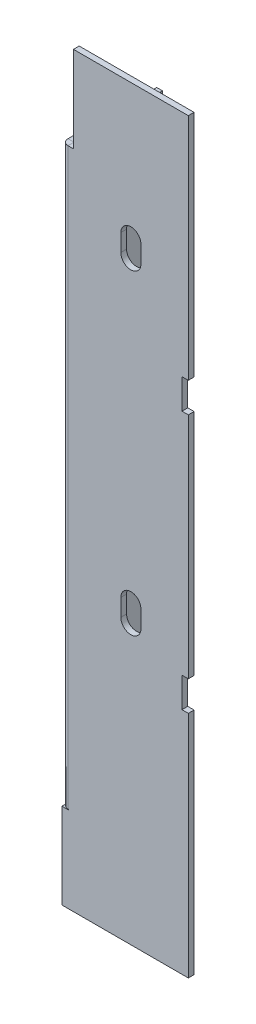
ISO-10303-21;
HEADER;
FILE_DESCRIPTION(('STEP AP214'),'2;1');
FILE_NAME('part.step','',(''),(''),'','','');
FILE_SCHEMA(('AUTOMOTIVE_DESIGN { 1 0 10303 214 1 1 1 1 }'));
ENDSEC;
DATA;
#1=APPLICATION_CONTEXT('core data for automotive mechanical design processes');
#2=APPLICATION_PROTOCOL_DEFINITION('international standard','automotive_design',2000,#1);
#3=PRODUCT_CONTEXT('',#1,'mechanical');
#4=PRODUCT('Part','Part','',(#3));
#5=PRODUCT_RELATED_PRODUCT_CATEGORY('part','',(#4));
#6=PRODUCT_DEFINITION_FORMATION('','',#4);
#7=PRODUCT_DEFINITION_CONTEXT('part definition',#1,'design');
#8=PRODUCT_DEFINITION('design','',#6,#7);
#9=PRODUCT_DEFINITION_SHAPE('','',#8);
#10=(LENGTH_UNIT() NAMED_UNIT(*) SI_UNIT(.MILLI.,.METRE.));
#11=(NAMED_UNIT(*) PLANE_ANGLE_UNIT() SI_UNIT($,.RADIAN.));
#12=(NAMED_UNIT(*) SI_UNIT($,.STERADIAN.) SOLID_ANGLE_UNIT());
#13=UNCERTAINTY_MEASURE_WITH_UNIT(LENGTH_MEASURE(1.E-05),#10,'distance_accuracy_value','');
#14=(GEOMETRIC_REPRESENTATION_CONTEXT(3) GLOBAL_UNCERTAINTY_ASSIGNED_CONTEXT((#13)) GLOBAL_UNIT_ASSIGNED_CONTEXT((#10,
#11,#12)) REPRESENTATION_CONTEXT('',''));
#15=CARTESIAN_POINT('',(0.,0.,0.));
#16=DIRECTION('',(0.,0.,1.));
#17=DIRECTION('',(1.,0.,0.));
#18=AXIS2_PLACEMENT_3D('',#15,#16,#17);
#19=CARTESIAN_POINT('',(860.745895593766,-50.,-971.));
#20=DIRECTION('',(0.,0.,1.));
#21=DIRECTION('',(1.,0.,0.));
#22=AXIS2_PLACEMENT_3D('',#19,#20,#21);
#23=PLANE('',#22);
#24=DIRECTION('',(0.,1.,0.));
#25=VECTOR('',#24,1.);
#26=CARTESIAN_POINT('',(456.,-50.,-971.));
#27=LINE('',#26,#25);
#28=CARTESIAN_POINT('',(456.,-50.,-971.));
#29=VERTEX_POINT('',#28);
#30=CARTESIAN_POINT('',(456.,150.,-971.));
#31=VERTEX_POINT('',#30);
#32=EDGE_CURVE('E267',#29,#31,#27,.T.);
#33=ORIENTED_EDGE('',*,*,#32,.T.);
#34=DIRECTION('',(-1.,0.,0.));
#35=VECTOR('',#34,1.);
#36=CARTESIAN_POINT('',(860.745895593766,150.,-971.));
#37=LINE('',#36,#35);
#38=CARTESIAN_POINT('',(458.,150.,-971.));
#39=VERTEX_POINT('',#38);
#40=EDGE_CURVE('E746',#39,#31,#37,.T.);
#41=ORIENTED_EDGE('',*,*,#40,.F.);
#42=DIRECTION('',(0.,1.,0.));
#43=VECTOR('',#42,1.);
#44=CARTESIAN_POINT('',(458.,-50.,-971.));
#45=LINE('',#44,#43);
#46=CARTESIAN_POINT('',(458.,-50.,-971.));
#47=VERTEX_POINT('',#46);
#48=EDGE_CURVE('E59',#47,#39,#45,.T.);
#49=ORIENTED_EDGE('',*,*,#48,.F.);
#50=DIRECTION('',(-1.,0.,0.));
#51=VECTOR('',#50,1.);
#52=CARTESIAN_POINT('',(860.745895593766,-50.,-971.));
#53=LINE('',#52,#51);
#54=EDGE_CURVE('E280',#47,#29,#53,.T.);
#55=ORIENTED_EDGE('',*,*,#54,.T.);
#56=EDGE_LOOP('',(#33,#41,#49,#55));
#57=FACE_BOUND('',#56,.T.);
#58=ADVANCED_FACE('F47',(#57),#23,.F.);
#59=CARTESIAN_POINT('',(860.745895593766,-50.,-971.));
#60=DIRECTION('',(0.,-1.,0.));
#61=DIRECTION('',(1.,0.,0.));
#62=AXIS2_PLACEMENT_3D('',#59,#60,#61);
#63=PLANE('',#62);
#64=DIRECTION('',(-1.,0.,0.));
#65=VECTOR('',#64,1.);
#66=CARTESIAN_POINT('',(860.745895593766,-50.,-940.1));
#67=LINE('',#66,#65);
#68=CARTESIAN_POINT('',(458.,-50.,-940.1));
#69=VERTEX_POINT('',#68);
#70=CARTESIAN_POINT('',(456.,-50.,-940.1));
#71=VERTEX_POINT('',#70);
#72=EDGE_CURVE('E270',#69,#71,#67,.T.);
#73=ORIENTED_EDGE('',*,*,#72,.T.);
#74=DIRECTION('',(0.,0.,-1.));
#75=VECTOR('',#74,1.);
#76=CARTESIAN_POINT('',(456.,-50.,-971.));
#77=LINE('',#76,#75);
#78=EDGE_CURVE('E87',#71,#29,#77,.T.);
#79=ORIENTED_EDGE('',*,*,#78,.T.);
#80=ORIENTED_EDGE('',*,*,#54,.F.);
#81=DIRECTION('',(0.,0.,1.));
#82=VECTOR('',#81,1.);
#83=CARTESIAN_POINT('',(458.,-50.,-971.));
#84=LINE('',#83,#82);
#85=EDGE_CURVE('E269',#47,#69,#84,.T.);
#86=ORIENTED_EDGE('',*,*,#85,.T.);
#87=EDGE_LOOP('',(#73,#79,#80,#86));
#88=FACE_BOUND('',#87,.T.);
#89=ADVANCED_FACE('F273',(#88),#63,.T.);
#90=CARTESIAN_POINT('',(456.,150.,-938.));
#91=DIRECTION('',(-1.,0.,0.));
#92=DIRECTION('',(0.,0.,1.));
#93=AXIS2_PLACEMENT_3D('',#90,#91,#92);
#94=PLANE('',#93);
#95=DIRECTION('',(0.,-1.,0.));
#96=VECTOR('',#95,1.);
#97=CARTESIAN_POINT('',(456.,-50.,-940.1));
#98=LINE('',#97,#96);
#99=CARTESIAN_POINT('',(456.,150.,-940.1));
#100=VERTEX_POINT('',#99);
#101=EDGE_CURVE('E264',#100,#71,#98,.T.);
#102=ORIENTED_EDGE('',*,*,#101,.F.);
#103=DIRECTION('',(0.,0.,1.));
#104=VECTOR('',#103,1.);
#105=CARTESIAN_POINT('',(456.,150.,-971.));
#106=LINE('',#105,#104);
#107=EDGE_CURVE('E745',#31,#100,#106,.T.);
#108=ORIENTED_EDGE('',*,*,#107,.F.);
#109=ORIENTED_EDGE('',*,*,#32,.F.);
#110=ORIENTED_EDGE('',*,*,#78,.F.);
#111=EDGE_LOOP('',(#102,#108,#109,#110));
#112=FACE_BOUND('',#111,.T.);
#113=ADVANCED_FACE('F261',(#112),#94,.T.);
#114=CARTESIAN_POINT('',(860.745895593766,150.,-971.));
#115=DIRECTION('',(0.,-1.,0.));
#116=DIRECTION('',(1.,0.,0.));
#117=AXIS2_PLACEMENT_3D('',#114,#115,#116);
#118=PLANE('',#117);
#119=ORIENTED_EDGE('',*,*,#107,.T.);
#120=DIRECTION('',(-1.,0.,0.));
#121=VECTOR('',#120,1.);
#122=CARTESIAN_POINT('',(860.745895593766,150.,-940.1));
#123=LINE('',#122,#121);
#124=CARTESIAN_POINT('',(458.,150.,-940.1));
#125=VERTEX_POINT('',#124);
#126=EDGE_CURVE('E291',#125,#100,#123,.T.);
#127=ORIENTED_EDGE('',*,*,#126,.F.);
#128=DIRECTION('',(0.,0.,1.));
#129=VECTOR('',#128,1.);
#130=CARTESIAN_POINT('',(458.,150.,-971.));
#131=LINE('',#130,#129);
#132=EDGE_CURVE('E12',#39,#125,#131,.T.);
#133=ORIENTED_EDGE('',*,*,#132,.F.);
#134=ORIENTED_EDGE('',*,*,#40,.T.);
#135=EDGE_LOOP('',(#119,#127,#133,#134));
#136=FACE_BOUND('',#135,.T.);
#137=ADVANCED_FACE('F739',(#136),#118,.F.);
#138=CARTESIAN_POINT('',(458.,-50.,-971.));
#139=DIRECTION('',(1.,0.,0.));
#140=DIRECTION('',(0.,0.,-1.));
#141=AXIS2_PLACEMENT_3D('',#138,#139,#140);
#142=PLANE('',#141);
#143=DIRECTION('',(0.,1.,0.));
#144=VECTOR('',#143,1.);
#145=CARTESIAN_POINT('',(458.,-50.,-940.1));
#146=LINE('',#145,#144);
#147=EDGE_CURVE('E51',#69,#125,#146,.T.);
#148=ORIENTED_EDGE('',*,*,#147,.F.);
#149=ORIENTED_EDGE('',*,*,#85,.F.);
#150=ORIENTED_EDGE('',*,*,#48,.T.);
#151=ORIENTED_EDGE('',*,*,#132,.T.);
#152=EDGE_LOOP('',(#148,#149,#150,#151));
#153=FACE_BOUND('',#152,.T.);
#154=ADVANCED_FACE('F49',(#153),#142,.T.);
#155=CARTESIAN_POINT('',(498.,-78.,-938.));
#156=DIRECTION('',(0.,0.,1.));
#157=DIRECTION('',(1.,0.,0.));
#158=AXIS2_PLACEMENT_3D('',#155,#156,#157);
#159=PLANE('',#158);
#160=CARTESIAN_POINT('',(480.,17.0000000000001,-938.));
#161=DIRECTION('',(0.,0.,-1.));
#162=DIRECTION('',(-1.,0.,0.));
#163=AXIS2_PLACEMENT_3D('',#160,#161,#162);
#164=CIRCLE('',#163,3.5);
#165=CARTESIAN_POINT('',(476.5,17.0000000000001,-938.));
#166=VERTEX_POINT('',#165);
#167=CARTESIAN_POINT('',(483.5,17.0000000000001,-938.));
#168=VERTEX_POINT('',#167);
#169=EDGE_CURVE('E414',#166,#168,#164,.F.);
#170=ORIENTED_EDGE('',*,*,#169,.F.);
#171=DIRECTION('',(0.,-1.,0.));
#172=VECTOR('',#171,1.);
#173=CARTESIAN_POINT('',(476.5,17.0000000000001,-938.));
#174=LINE('',#173,#172);
#175=CARTESIAN_POINT('',(476.5,23.0000000000001,-938.));
#176=VERTEX_POINT('',#175);
#177=EDGE_CURVE('E407',#176,#166,#174,.T.);
#178=ORIENTED_EDGE('',*,*,#177,.F.);
#179=CARTESIAN_POINT('',(480.,23.0000000000001,-938.));
#180=DIRECTION('',(0.,0.,-1.));
#181=DIRECTION('',(-1.,0.,0.));
#182=AXIS2_PLACEMENT_3D('',#179,#180,#181);
#183=CIRCLE('',#182,3.5);
#184=CARTESIAN_POINT('',(483.5,23.0000000000001,-938.));
#185=VERTEX_POINT('',#184);
#186=EDGE_CURVE('E413',#185,#176,#183,.F.);
#187=ORIENTED_EDGE('',*,*,#186,.F.);
#188=DIRECTION('',(0.,1.,0.));
#189=VECTOR('',#188,1.);
#190=CARTESIAN_POINT('',(483.5,17.0000000000001,-938.));
#191=LINE('',#190,#189);
#192=EDGE_CURVE('E418',#168,#185,#191,.T.);
#193=ORIENTED_EDGE('',*,*,#192,.F.);
#194=EDGE_LOOP('',(#170,#178,#187,#193));
#195=FACE_BOUND('',#194,.T.);
#196=CARTESIAN_POINT('',(480.,127.,-938.));
#197=DIRECTION('',(0.,0.,-1.));
#198=DIRECTION('',(-1.,0.,0.));
#199=AXIS2_PLACEMENT_3D('',#196,#197,#198);
#200=CIRCLE('',#199,3.5);
#201=CARTESIAN_POINT('',(476.5,127.,-938.));
#202=VERTEX_POINT('',#201);
#203=CARTESIAN_POINT('',(483.5,127.,-938.));
#204=VERTEX_POINT('',#203);
#205=EDGE_CURVE('E423',#202,#204,#200,.F.);
#206=ORIENTED_EDGE('',*,*,#205,.F.);
#207=DIRECTION('',(0.,-1.,0.));
#208=VECTOR('',#207,1.);
#209=CARTESIAN_POINT('',(476.5,127.,-938.));
#210=LINE('',#209,#208);
#211=CARTESIAN_POINT('',(476.5,133.,-938.));
#212=VERTEX_POINT('',#211);
#213=EDGE_CURVE('E426',#212,#202,#210,.T.);
#214=ORIENTED_EDGE('',*,*,#213,.F.);
#215=CARTESIAN_POINT('',(480.,133.,-938.));
#216=DIRECTION('',(0.,0.,-1.));
#217=DIRECTION('',(-1.,0.,0.));
#218=AXIS2_PLACEMENT_3D('',#215,#216,#217);
#219=CIRCLE('',#218,3.50000000000003);
#220=CARTESIAN_POINT('',(483.5,133.,-938.));
#221=VERTEX_POINT('',#220);
#222=EDGE_CURVE('E577',#221,#212,#219,.F.);
#223=ORIENTED_EDGE('',*,*,#222,.F.);
#224=DIRECTION('',(0.,1.,0.));
#225=VECTOR('',#224,1.);
#226=CARTESIAN_POINT('',(483.5,127.,-938.));
#227=LINE('',#226,#225);
#228=EDGE_CURVE('E431',#204,#221,#227,.T.);
#229=ORIENTED_EDGE('',*,*,#228,.F.);
#230=EDGE_LOOP('',(#206,#214,#223,#229));
#231=FACE_BOUND('',#230,.T.);
#232=DIRECTION('',(1.,0.,0.));
#233=VECTOR('',#232,1.);
#234=CARTESIAN_POINT('',(458.,150.,-938.));
#235=LINE('',#234,#233);
#236=CARTESIAN_POINT('',(458.1,150.,-938.));
#237=VERTEX_POINT('',#236);
#238=CARTESIAN_POINT('',(460.,150.,-938.));
#239=VERTEX_POINT('',#238);
#240=EDGE_CURVE('E440',#237,#239,#235,.T.);
#241=ORIENTED_EDGE('',*,*,#240,.F.);
#242=DIRECTION('',(0.,-1.,0.));
#243=VECTOR('',#242,1.);
#244=CARTESIAN_POINT('',(458.1,-50.,-938.));
#245=LINE('',#244,#243);
#246=CARTESIAN_POINT('',(458.1,-50.,-938.));
#247=VERTEX_POINT('',#246);
#248=EDGE_CURVE('E322',#237,#247,#245,.T.);
#249=ORIENTED_EDGE('',*,*,#248,.T.);
#250=DIRECTION('',(1.,0.,0.));
#251=VECTOR('',#250,1.);
#252=CARTESIAN_POINT('',(498.,-50.,-938.));
#253=LINE('',#252,#251);
#254=CARTESIAN_POINT('',(458.3,-50.,-938.));
#255=VERTEX_POINT('',#254);
#256=EDGE_CURVE('E445',#247,#255,#253,.T.);
#257=ORIENTED_EDGE('',*,*,#256,.T.);
#258=DIRECTION('',(0.,-1.,0.));
#259=VECTOR('',#258,1.);
#260=CARTESIAN_POINT('',(458.3,-78.,-938.));
#261=LINE('',#260,#259);
#262=CARTESIAN_POINT('',(458.3,-50.2,-938.));
#263=VERTEX_POINT('',#262);
#264=EDGE_CURVE('E718',#255,#263,#261,.T.);
#265=ORIENTED_EDGE('',*,*,#264,.T.);
#266=DIRECTION('',(-1.,0.,0.));
#267=VECTOR('',#266,1.);
#268=CARTESIAN_POINT('',(498.,-50.2,-938.));
#269=LINE('',#268,#267);
#270=CARTESIAN_POINT('',(456.,-50.2,-938.));
#271=VERTEX_POINT('',#270);
#272=EDGE_CURVE('E1059',#263,#271,#269,.T.);
#273=ORIENTED_EDGE('',*,*,#272,.T.);
#274=DIRECTION('',(0.,1.,0.));
#275=VECTOR('',#274,1.);
#276=CARTESIAN_POINT('',(456.,150.,-938.));
#277=LINE('',#276,#275);
#278=CARTESIAN_POINT('',(456.,-80.,-938.));
#279=VERTEX_POINT('',#278);
#280=EDGE_CURVE('E1070',#279,#271,#277,.T.);
#281=ORIENTED_EDGE('',*,*,#280,.F.);
#282=DIRECTION('',(1.,0.,0.));
#283=VECTOR('',#282,1.);
#284=CARTESIAN_POINT('',(498.,-79.9999999999999,-938.));
#285=LINE('',#284,#283);
#286=CARTESIAN_POINT('',(500.,-80.,-937.999999999988));
#287=VERTEX_POINT('',#286);
#288=EDGE_CURVE('E1066',#279,#287,#285,.T.);
#289=ORIENTED_EDGE('',*,*,#288,.T.);
#290=DIRECTION('',(0.,1.,0.));
#291=VECTOR('',#290,1.);
#292=CARTESIAN_POINT('',(500.,180.,-938.));
#293=LINE('',#292,#291);
#294=CARTESIAN_POINT('',(500.,-0.200000000000033,-938.));
#295=VERTEX_POINT('',#294);
#296=EDGE_CURVE('E1069',#287,#295,#293,.T.);
#297=ORIENTED_EDGE('',*,*,#296,.T.);
#298=DIRECTION('',(-1.,0.,0.));
#299=VECTOR('',#298,1.);
#300=CARTESIAN_POINT('',(500.2,-0.199999999999986,-937.999999999991));
#301=LINE('',#300,#299);
#302=CARTESIAN_POINT('',(497.8,-0.199999999999986,-937.999999999991));
#303=VERTEX_POINT('',#302);
#304=EDGE_CURVE('E1074',#295,#303,#301,.T.);
#305=ORIENTED_EDGE('',*,*,#304,.T.);
#306=DIRECTION('',(0.,-1.,0.));
#307=VECTOR('',#306,1.);
#308=CARTESIAN_POINT('',(497.8,10.2,-937.999999999992));
#309=LINE('',#308,#307);
#310=CARTESIAN_POINT('',(497.8,10.2,-937.999999999992));
#311=VERTEX_POINT('',#310);
#312=EDGE_CURVE('E680',#311,#303,#309,.T.);
#313=ORIENTED_EDGE('',*,*,#312,.F.);
#314=DIRECTION('',(-1.,0.,0.));
#315=VECTOR('',#314,1.);
#316=CARTESIAN_POINT('',(500.2,10.2,-937.999999999992));
#317=LINE('',#316,#315);
#318=CARTESIAN_POINT('',(500.,10.2,-937.999999999992));
#319=VERTEX_POINT('',#318);
#320=EDGE_CURVE('E674',#319,#311,#317,.T.);
#321=ORIENTED_EDGE('',*,*,#320,.F.);
#322=DIRECTION('',(0.,1.,0.));
#323=VECTOR('',#322,1.);
#324=CARTESIAN_POINT('',(500.,180.,-938.));
#325=LINE('',#324,#323);
#326=CARTESIAN_POINT('',(500.,89.8,-938.));
#327=VERTEX_POINT('',#326);
#328=EDGE_CURVE('E670',#319,#327,#325,.T.);
#329=ORIENTED_EDGE('',*,*,#328,.T.);
#330=DIRECTION('',(-1.,0.,0.));
#331=VECTOR('',#330,1.);
#332=CARTESIAN_POINT('',(500.2,89.8,-937.999999999996));
#333=LINE('',#332,#331);
#334=CARTESIAN_POINT('',(497.8,89.8,-937.999999999996));
#335=VERTEX_POINT('',#334);
#336=EDGE_CURVE('E673',#327,#335,#333,.T.);
#337=ORIENTED_EDGE('',*,*,#336,.T.);
#338=DIRECTION('',(0.,-1.,0.));
#339=VECTOR('',#338,1.);
#340=CARTESIAN_POINT('',(497.8,100.2,-937.999999999996));
#341=LINE('',#340,#339);
#342=CARTESIAN_POINT('',(497.8,100.2,-937.999999999996));
#343=VERTEX_POINT('',#342);
#344=EDGE_CURVE('E678',#343,#335,#341,.T.);
#345=ORIENTED_EDGE('',*,*,#344,.F.);
#346=DIRECTION('',(-1.,0.,0.));
#347=VECTOR('',#346,1.);
#348=CARTESIAN_POINT('',(500.2,100.2,-937.999999999996));
#349=LINE('',#348,#347);
#350=CARTESIAN_POINT('',(500.,100.2,-937.999999999996));
#351=VERTEX_POINT('',#350);
#352=EDGE_CURVE('E684',#351,#343,#349,.T.);
#353=ORIENTED_EDGE('',*,*,#352,.F.);
#354=CARTESIAN_POINT('',(500.,180.,-938.));
#355=VERTEX_POINT('',#354);
#356=EDGE_CURVE('E647',#351,#355,#325,.T.);
#357=ORIENTED_EDGE('',*,*,#356,.T.);
#358=DIRECTION('',(-1.,0.,0.));
#359=VECTOR('',#358,1.);
#360=CARTESIAN_POINT('',(0.,180.,-938.));
#361=LINE('',#360,#359);
#362=CARTESIAN_POINT('',(460.,180.,-938.));
#363=VERTEX_POINT('',#362);
#364=EDGE_CURVE('E643',#355,#363,#361,.T.);
#365=ORIENTED_EDGE('',*,*,#364,.T.);
#366=DIRECTION('',(0.,-1.,0.));
#367=VECTOR('',#366,1.);
#368=CARTESIAN_POINT('',(460.,150.,-938.));
#369=LINE('',#368,#367);
#370=EDGE_CURVE('E446',#363,#239,#369,.T.);
#371=ORIENTED_EDGE('',*,*,#370,.T.);
#372=EDGE_LOOP('',(#241,#249,#257,#265,#273,#281,#289,#297,#305,#313,#321,#329,#337,#345,#353,
#357,#365,#371));
#373=FACE_BOUND('',#372,.T.);
#374=ADVANCED_FACE('F596',(#195,#231,#373),#159,.T.);
#375=CARTESIAN_POINT('',(0.,0.,-940.));
#376=DIRECTION('',(0.,0.,1.));
#377=DIRECTION('',(1.,0.,0.));
#378=AXIS2_PLACEMENT_3D('',#375,#376,#377);
#379=PLANE('',#378);
#380=CARTESIAN_POINT('',(480.,23.0000000000001,-940.));
#381=DIRECTION('',(0.,0.,-1.));
#382=DIRECTION('',(-1.,0.,0.));
#383=AXIS2_PLACEMENT_3D('',#380,#381,#382);
#384=CIRCLE('',#383,3.5);
#385=CARTESIAN_POINT('',(476.5,23.0000000000001,-940.));
#386=VERTEX_POINT('',#385);
#387=CARTESIAN_POINT('',(483.5,23.0000000000001,-940.));
#388=VERTEX_POINT('',#387);
#389=EDGE_CURVE('E494',#386,#388,#384,.T.);
#390=ORIENTED_EDGE('',*,*,#389,.F.);
#391=DIRECTION('',(0.,1.,0.));
#392=VECTOR('',#391,1.);
#393=CARTESIAN_POINT('',(476.5,17.0000000000001,-940.));
#394=LINE('',#393,#392);
#395=CARTESIAN_POINT('',(476.5,17.0000000000001,-940.));
#396=VERTEX_POINT('',#395);
#397=EDGE_CURVE('E612',#396,#386,#394,.T.);
#398=ORIENTED_EDGE('',*,*,#397,.F.);
#399=CARTESIAN_POINT('',(480.,17.0000000000001,-940.));
#400=DIRECTION('',(0.,0.,-1.));
#401=DIRECTION('',(-1.,0.,0.));
#402=AXIS2_PLACEMENT_3D('',#399,#400,#401);
#403=CIRCLE('',#402,3.5);
#404=CARTESIAN_POINT('',(483.5,17.0000000000001,-940.));
#405=VERTEX_POINT('',#404);
#406=EDGE_CURVE('E607',#405,#396,#403,.T.);
#407=ORIENTED_EDGE('',*,*,#406,.F.);
#408=DIRECTION('',(0.,-1.,0.));
#409=VECTOR('',#408,1.);
#410=CARTESIAN_POINT('',(483.5,17.0000000000001,-940.));
#411=LINE('',#410,#409);
#412=EDGE_CURVE('E603',#388,#405,#411,.T.);
#413=ORIENTED_EDGE('',*,*,#412,.F.);
#414=EDGE_LOOP('',(#390,#398,#407,#413));
#415=FACE_BOUND('',#414,.T.);
#416=CARTESIAN_POINT('',(480.,133.,-940.));
#417=DIRECTION('',(0.,0.,-1.));
#418=DIRECTION('',(-1.,0.,0.));
#419=AXIS2_PLACEMENT_3D('',#416,#417,#418);
#420=CIRCLE('',#419,3.50000000000003);
#421=CARTESIAN_POINT('',(476.5,133.,-940.));
#422=VERTEX_POINT('',#421);
#423=CARTESIAN_POINT('',(483.5,133.,-940.));
#424=VERTEX_POINT('',#423);
#425=EDGE_CURVE('E302',#422,#424,#420,.T.);
#426=ORIENTED_EDGE('',*,*,#425,.F.);
#427=DIRECTION('',(0.,1.,0.));
#428=VECTOR('',#427,1.);
#429=CARTESIAN_POINT('',(476.5,127.,-940.));
#430=LINE('',#429,#428);
#431=CARTESIAN_POINT('',(476.5,127.,-940.));
#432=VERTEX_POINT('',#431);
#433=EDGE_CURVE('E480',#432,#422,#430,.T.);
#434=ORIENTED_EDGE('',*,*,#433,.F.);
#435=CARTESIAN_POINT('',(480.,127.,-940.));
#436=DIRECTION('',(0.,0.,-1.));
#437=DIRECTION('',(-1.,0.,0.));
#438=AXIS2_PLACEMENT_3D('',#435,#436,#437);
#439=CIRCLE('',#438,3.5);
#440=CARTESIAN_POINT('',(483.5,127.,-940.));
#441=VERTEX_POINT('',#440);
#442=EDGE_CURVE('E485',#441,#432,#439,.T.);
#443=ORIENTED_EDGE('',*,*,#442,.F.);
#444=DIRECTION('',(0.,-1.,0.));
#445=VECTOR('',#444,1.);
#446=CARTESIAN_POINT('',(483.5,127.,-940.));
#447=LINE('',#446,#445);
#448=EDGE_CURVE('E490',#424,#441,#447,.T.);
#449=ORIENTED_EDGE('',*,*,#448,.F.);
#450=EDGE_LOOP('',(#426,#434,#443,#449));
#451=FACE_BOUND('',#450,.T.);
#452=DIRECTION('',(0.,-1.,0.));
#453=VECTOR('',#452,1.);
#454=CARTESIAN_POINT('',(458.1,-50.,-940.));
#455=LINE('',#454,#453);
#456=CARTESIAN_POINT('',(458.1,150.,-940.));
#457=VERTEX_POINT('',#456);
#458=CARTESIAN_POINT('',(458.1,-50.,-940.));
#459=VERTEX_POINT('',#458);
#460=EDGE_CURVE('E316',#457,#459,#455,.T.);
#461=ORIENTED_EDGE('',*,*,#460,.F.);
#462=DIRECTION('',(1.,0.,0.));
#463=VECTOR('',#462,1.);
#464=CARTESIAN_POINT('',(458.,150.,-940.));
#465=LINE('',#464,#463);
#466=CARTESIAN_POINT('',(460.,150.,-940.));
#467=VERTEX_POINT('',#466);
#468=EDGE_CURVE('E511',#457,#467,#465,.T.);
#469=ORIENTED_EDGE('',*,*,#468,.T.);
#470=DIRECTION('',(0.,1.,0.));
#471=VECTOR('',#470,1.);
#472=CARTESIAN_POINT('',(460.,150.,-940.));
#473=LINE('',#472,#471);
#474=CARTESIAN_POINT('',(460.,180.,-940.));
#475=VERTEX_POINT('',#474);
#476=EDGE_CURVE('E98',#467,#475,#473,.T.);
#477=ORIENTED_EDGE('',*,*,#476,.T.);
#478=DIRECTION('',(-1.,0.,0.));
#479=VECTOR('',#478,1.);
#480=CARTESIAN_POINT('',(-500.,180.,-940.));
#481=LINE('',#480,#479);
#482=CARTESIAN_POINT('',(500.,180.,-940.));
#483=VERTEX_POINT('',#482);
#484=EDGE_CURVE('E106',#483,#475,#481,.T.);
#485=ORIENTED_EDGE('',*,*,#484,.F.);
#486=DIRECTION('',(0.,-1.,0.));
#487=VECTOR('',#486,1.);
#488=CARTESIAN_POINT('',(500.,180.,-940.));
#489=LINE('',#488,#487);
#490=CARTESIAN_POINT('',(500.,100.2,-940.));
#491=VERTEX_POINT('',#490);
#492=EDGE_CURVE('E524',#483,#491,#489,.T.);
#493=ORIENTED_EDGE('',*,*,#492,.T.);
#494=DIRECTION('',(-1.,0.,0.));
#495=VECTOR('',#494,1.);
#496=CARTESIAN_POINT('',(500.2,100.2,-940.000000000008));
#497=LINE('',#496,#495);
#498=CARTESIAN_POINT('',(497.8,100.2,-940.));
#499=VERTEX_POINT('',#498);
#500=EDGE_CURVE('E532',#491,#499,#497,.T.);
#501=ORIENTED_EDGE('',*,*,#500,.T.);
#502=DIRECTION('',(0.,1.,0.));
#503=VECTOR('',#502,1.);
#504=CARTESIAN_POINT('',(497.8,100.2,-940.000000000008));
#505=LINE('',#504,#503);
#506=CARTESIAN_POINT('',(497.8,89.7999999999999,-940.));
#507=VERTEX_POINT('',#506);
#508=EDGE_CURVE('E536',#507,#499,#505,.T.);
#509=ORIENTED_EDGE('',*,*,#508,.F.);
#510=DIRECTION('',(-1.,0.,0.));
#511=VECTOR('',#510,1.);
#512=CARTESIAN_POINT('',(500.2,89.7999999999999,-940.000000000008));
#513=LINE('',#512,#511);
#514=CARTESIAN_POINT('',(500.,89.7999999999999,-940.));
#515=VERTEX_POINT('',#514);
#516=EDGE_CURVE('E540',#515,#507,#513,.T.);
#517=ORIENTED_EDGE('',*,*,#516,.F.);
#518=CARTESIAN_POINT('',(500.,10.1999999999999,-940.));
#519=VERTEX_POINT('',#518);
#520=EDGE_CURVE('E544',#515,#519,#489,.T.);
#521=ORIENTED_EDGE('',*,*,#520,.T.);
#522=DIRECTION('',(-1.,0.,0.));
#523=VECTOR('',#522,1.);
#524=CARTESIAN_POINT('',(500.2,10.1999999999999,-940.000000000004));
#525=LINE('',#524,#523);
#526=CARTESIAN_POINT('',(497.8,10.1999999999999,-940.));
#527=VERTEX_POINT('',#526);
#528=EDGE_CURVE('E545',#519,#527,#525,.T.);
#529=ORIENTED_EDGE('',*,*,#528,.T.);
#530=DIRECTION('',(0.,1.,0.));
#531=VECTOR('',#530,1.);
#532=CARTESIAN_POINT('',(497.8,10.1999999999999,-940.000000000004));
#533=LINE('',#532,#531);
#534=CARTESIAN_POINT('',(497.8,-0.200000000000072,-940.));
#535=VERTEX_POINT('',#534);
#536=EDGE_CURVE('E554',#535,#527,#533,.T.);
#537=ORIENTED_EDGE('',*,*,#536,.F.);
#538=DIRECTION('',(-1.,0.,0.));
#539=VECTOR('',#538,1.);
#540=CARTESIAN_POINT('',(500.2,-0.200000000000072,-940.000000000004));
#541=LINE('',#540,#539);
#542=CARTESIAN_POINT('',(500.,-0.200000000000072,-940.));
#543=VERTEX_POINT('',#542);
#544=EDGE_CURVE('E557',#543,#535,#541,.T.);
#545=ORIENTED_EDGE('',*,*,#544,.F.);
#546=DIRECTION('',(0.,-1.,0.));
#547=VECTOR('',#546,1.);
#548=CARTESIAN_POINT('',(500.,180.,-940.));
#549=LINE('',#548,#547);
#550=CARTESIAN_POINT('',(500.,-80.,-940.));
#551=VERTEX_POINT('',#550);
#552=EDGE_CURVE('E561',#543,#551,#549,.T.);
#553=ORIENTED_EDGE('',*,*,#552,.T.);
#554=DIRECTION('',(1.,0.,0.));
#555=VECTOR('',#554,1.);
#556=CARTESIAN_POINT('',(500.,-80.,-940.));
#557=LINE('',#556,#555);
#558=CARTESIAN_POINT('',(456.,-80.,-940.));
#559=VERTEX_POINT('',#558);
#560=EDGE_CURVE('E566',#559,#551,#557,.T.);
#561=ORIENTED_EDGE('',*,*,#560,.F.);
#562=DIRECTION('',(0.,-1.,0.));
#563=VECTOR('',#562,1.);
#564=CARTESIAN_POINT('',(456.,0.,-940.));
#565=LINE('',#564,#563);
#566=CARTESIAN_POINT('',(456.,-50.2,-940.));
#567=VERTEX_POINT('',#566);
#568=EDGE_CURVE('E573',#567,#559,#565,.T.);
#569=ORIENTED_EDGE('',*,*,#568,.F.);
#570=DIRECTION('',(-1.,0.,0.));
#571=VECTOR('',#570,1.);
#572=CARTESIAN_POINT('',(0.,-50.2,-940.));
#573=LINE('',#572,#571);
#574=CARTESIAN_POINT('',(458.3,-50.2,-940.));
#575=VERTEX_POINT('',#574);
#576=EDGE_CURVE('E606',#575,#567,#573,.T.);
#577=ORIENTED_EDGE('',*,*,#576,.F.);
#578=DIRECTION('',(0.,-1.,0.));
#579=VECTOR('',#578,1.);
#580=CARTESIAN_POINT('',(458.3,0.,-940.));
#581=LINE('',#580,#579);
#582=CARTESIAN_POINT('',(458.3,-50.,-940.));
#583=VERTEX_POINT('',#582);
#584=EDGE_CURVE('E611',#583,#575,#581,.T.);
#585=ORIENTED_EDGE('',*,*,#584,.F.);
#586=DIRECTION('',(1.,0.,0.));
#587=VECTOR('',#586,1.);
#588=CARTESIAN_POINT('',(0.,-50.,-940.));
#589=LINE('',#588,#587);
#590=EDGE_CURVE('E515',#459,#583,#589,.T.);
#591=ORIENTED_EDGE('',*,*,#590,.F.);
#592=EDGE_LOOP('',(#461,#469,#477,#485,#493,#501,#509,#517,#521,#529,#537,#545,#553,#561,#569,
#577,#585,#591));
#593=FACE_BOUND('',#592,.T.);
#594=ADVANCED_FACE('F632',(#415,#451,#593),#379,.F.);
#595=CARTESIAN_POINT('',(476.5,127.,940.001));
#596=DIRECTION('',(-1.,0.,0.));
#597=DIRECTION('',(0.,-1.,0.));
#598=AXIS2_PLACEMENT_3D('',#595,#596,#597);
#599=PLANE('',#598);
#600=ORIENTED_EDGE('',*,*,#213,.T.);
#601=DIRECTION('',(0.,0.,-1.));
#602=VECTOR('',#601,1.);
#603=CARTESIAN_POINT('',(476.5,127.,940.001));
#604=LINE('',#603,#602);
#605=EDGE_CURVE('E323',#202,#432,#604,.T.);
#606=ORIENTED_EDGE('',*,*,#605,.T.);
#607=ORIENTED_EDGE('',*,*,#433,.T.);
#608=DIRECTION('',(0.,0.,-1.));
#609=VECTOR('',#608,1.);
#610=CARTESIAN_POINT('',(476.5,133.,940.001));
#611=LINE('',#610,#609);
#612=EDGE_CURVE('E580',#212,#422,#611,.T.);
#613=ORIENTED_EDGE('',*,*,#612,.F.);
#614=EDGE_LOOP('',(#600,#606,#607,#613));
#615=FACE_BOUND('',#614,.T.);
#616=ADVANCED_FACE('F478',(#615),#599,.F.);
#617=CARTESIAN_POINT('',(483.5,127.,940.001));
#618=DIRECTION('',(1.,0.,0.));
#619=DIRECTION('',(0.,0.,-1.));
#620=AXIS2_PLACEMENT_3D('',#617,#618,#619);
#621=PLANE('',#620);
#622=ORIENTED_EDGE('',*,*,#228,.T.);
#623=DIRECTION('',(0.,0.,-1.));
#624=VECTOR('',#623,1.);
#625=CARTESIAN_POINT('',(483.5,133.,940.001));
#626=LINE('',#625,#624);
#627=EDGE_CURVE('E582',#221,#424,#626,.T.);
#628=ORIENTED_EDGE('',*,*,#627,.T.);
#629=ORIENTED_EDGE('',*,*,#448,.T.);
#630=DIRECTION('',(0.,0.,-1.));
#631=VECTOR('',#630,1.);
#632=CARTESIAN_POINT('',(483.5,127.,940.001));
#633=LINE('',#632,#631);
#634=EDGE_CURVE('E467',#204,#441,#633,.T.);
#635=ORIENTED_EDGE('',*,*,#634,.F.);
#636=EDGE_LOOP('',(#622,#628,#629,#635));
#637=FACE_BOUND('',#636,.T.);
#638=ADVANCED_FACE('F719',(#637),#621,.F.);
#639=CARTESIAN_POINT('',(480.,127.,940.001));
#640=DIRECTION('',(0.,0.,-1.));
#641=DIRECTION('',(-1.,0.,0.));
#642=AXIS2_PLACEMENT_3D('',#639,#640,#641);
#643=CYLINDRICAL_SURFACE('',#642,3.5);
#644=ORIENTED_EDGE('',*,*,#205,.T.);
#645=ORIENTED_EDGE('',*,*,#634,.T.);
#646=ORIENTED_EDGE('',*,*,#442,.T.);
#647=ORIENTED_EDGE('',*,*,#605,.F.);
#648=EDGE_LOOP('',(#644,#645,#646,#647));
#649=FACE_BOUND('',#648,.T.);
#650=ADVANCED_FACE('F483',(#649),#643,.F.);
#651=CARTESIAN_POINT('',(476.5,17.0000000000001,940.001));
#652=DIRECTION('',(-1.,0.,0.));
#653=DIRECTION('',(0.,0.,1.));
#654=AXIS2_PLACEMENT_3D('',#651,#652,#653);
#655=PLANE('',#654);
#656=ORIENTED_EDGE('',*,*,#177,.T.);
#657=DIRECTION('',(0.,0.,-1.));
#658=VECTOR('',#657,1.);
#659=CARTESIAN_POINT('',(476.5,17.0000000000001,940.001));
#660=LINE('',#659,#658);
#661=EDGE_CURVE('E456',#166,#396,#660,.T.);
#662=ORIENTED_EDGE('',*,*,#661,.T.);
#663=ORIENTED_EDGE('',*,*,#397,.T.);
#664=DIRECTION('',(0.,0.,-1.));
#665=VECTOR('',#664,1.);
#666=CARTESIAN_POINT('',(476.5,23.0000000000001,940.001));
#667=LINE('',#666,#665);
#668=EDGE_CURVE('E464',#176,#386,#667,.T.);
#669=ORIENTED_EDGE('',*,*,#668,.F.);
#670=EDGE_LOOP('',(#656,#662,#663,#669));
#671=FACE_BOUND('',#670,.T.);
#672=ADVANCED_FACE('F710',(#671),#655,.F.);
#673=CARTESIAN_POINT('',(480.,23.0000000000001,940.001));
#674=DIRECTION('',(0.,0.,-1.));
#675=DIRECTION('',(-1.,0.,0.));
#676=AXIS2_PLACEMENT_3D('',#673,#674,#675);
#677=CYLINDRICAL_SURFACE('',#676,3.5);
#678=ORIENTED_EDGE('',*,*,#186,.T.);
#679=ORIENTED_EDGE('',*,*,#668,.T.);
#680=ORIENTED_EDGE('',*,*,#389,.T.);
#681=DIRECTION('',(0.,0.,-1.));
#682=VECTOR('',#681,1.);
#683=CARTESIAN_POINT('',(483.5,23.0000000000001,940.001));
#684=LINE('',#683,#682);
#685=EDGE_CURVE('E460',#185,#388,#684,.T.);
#686=ORIENTED_EDGE('',*,*,#685,.F.);
#687=EDGE_LOOP('',(#678,#679,#680,#686));
#688=FACE_BOUND('',#687,.T.);
#689=ADVANCED_FACE('F712',(#688),#677,.F.);
#690=CARTESIAN_POINT('',(483.5,17.0000000000001,940.001));
#691=DIRECTION('',(1.,0.,0.));
#692=DIRECTION('',(0.,0.,-1.));
#693=AXIS2_PLACEMENT_3D('',#690,#691,#692);
#694=PLANE('',#693);
#695=ORIENTED_EDGE('',*,*,#192,.T.);
#696=ORIENTED_EDGE('',*,*,#685,.T.);
#697=ORIENTED_EDGE('',*,*,#412,.T.);
#698=DIRECTION('',(0.,0.,-1.));
#699=VECTOR('',#698,1.);
#700=CARTESIAN_POINT('',(483.5,17.0000000000001,940.001));
#701=LINE('',#700,#699);
#702=EDGE_CURVE('E452',#168,#405,#701,.T.);
#703=ORIENTED_EDGE('',*,*,#702,.F.);
#704=EDGE_LOOP('',(#695,#696,#697,#703));
#705=FACE_BOUND('',#704,.T.);
#706=ADVANCED_FACE('F601',(#705),#694,.F.);
#707=CARTESIAN_POINT('',(480.,17.0000000000001,940.001));
#708=DIRECTION('',(0.,0.,-1.));
#709=DIRECTION('',(-1.,0.,0.));
#710=AXIS2_PLACEMENT_3D('',#707,#708,#709);
#711=CYLINDRICAL_SURFACE('',#710,3.5);
#712=ORIENTED_EDGE('',*,*,#169,.T.);
#713=ORIENTED_EDGE('',*,*,#702,.T.);
#714=ORIENTED_EDGE('',*,*,#406,.T.);
#715=ORIENTED_EDGE('',*,*,#661,.F.);
#716=EDGE_LOOP('',(#712,#713,#714,#715));
#717=FACE_BOUND('',#716,.T.);
#718=ADVANCED_FACE('F592',(#717),#711,.F.);
#719=CARTESIAN_POINT('',(480.,133.,940.001));
#720=DIRECTION('',(0.,0.,-1.));
#721=DIRECTION('',(-1.,0.,0.));
#722=AXIS2_PLACEMENT_3D('',#719,#720,#721);
#723=CYLINDRICAL_SURFACE('',#722,3.50000000000003);
#724=ORIENTED_EDGE('',*,*,#222,.T.);
#725=ORIENTED_EDGE('',*,*,#612,.T.);
#726=ORIENTED_EDGE('',*,*,#425,.T.);
#727=ORIENTED_EDGE('',*,*,#627,.F.);
#728=EDGE_LOOP('',(#724,#725,#726,#727));
#729=FACE_BOUND('',#728,.T.);
#730=ADVANCED_FACE('F716',(#729),#723,.F.);
#731=CARTESIAN_POINT('',(0.,-50.,-1465.39359116318));
#732=DIRECTION('',(0.,-1.,0.));
#733=DIRECTION('',(0.,0.,-1.));
#734=AXIS2_PLACEMENT_3D('',#731,#732,#733);
#735=PLANE('',#734);
#736=DIRECTION('',(0.,0.,1.));
#737=VECTOR('',#736,1.);
#738=CARTESIAN_POINT('',(458.3,-50.,-1465.39359116318));
#739=LINE('',#738,#737);
#740=EDGE_CURVE('E328',#583,#255,#739,.T.);
#741=ORIENTED_EDGE('',*,*,#740,.T.);
#742=ORIENTED_EDGE('',*,*,#256,.F.);
#743=DIRECTION('',(0.,0.,1.));
#744=VECTOR('',#743,1.);
#745=CARTESIAN_POINT('',(458.1,-50.,-1465.39359116318));
#746=LINE('',#745,#744);
#747=EDGE_CURVE('E296',#459,#247,#746,.T.);
#748=ORIENTED_EDGE('',*,*,#747,.F.);
#749=ORIENTED_EDGE('',*,*,#590,.T.);
#750=EDGE_LOOP('',(#741,#742,#748,#749));
#751=FACE_BOUND('',#750,.T.);
#752=ADVANCED_FACE('F735',(#751),#735,.T.);
#753=CARTESIAN_POINT('',(458.,150.,-1465.39359116318));
#754=DIRECTION('',(0.,-1.,0.));
#755=DIRECTION('',(0.,0.,-1.));
#756=AXIS2_PLACEMENT_3D('',#753,#754,#755);
#757=PLANE('',#756);
#758=ORIENTED_EDGE('',*,*,#240,.T.);
#759=DIRECTION('',(0.,0.,1.));
#760=VECTOR('',#759,1.);
#761=CARTESIAN_POINT('',(460.,150.,-1465.39359116318));
#762=LINE('',#761,#760);
#763=EDGE_CURVE('E387',#467,#239,#762,.T.);
#764=ORIENTED_EDGE('',*,*,#763,.F.);
#765=ORIENTED_EDGE('',*,*,#468,.F.);
#766=DIRECTION('',(0.,0.,1.));
#767=VECTOR('',#766,1.);
#768=CARTESIAN_POINT('',(458.1,150.,-1465.39359116318));
#769=LINE('',#768,#767);
#770=EDGE_CURVE('E390',#457,#237,#769,.T.);
#771=ORIENTED_EDGE('',*,*,#770,.T.);
#772=EDGE_LOOP('',(#758,#764,#765,#771));
#773=FACE_BOUND('',#772,.T.);
#774=ADVANCED_FACE('F638',(#773),#757,.F.);
#775=CARTESIAN_POINT('',(460.,150.,-1465.39359116318));
#776=DIRECTION('',(1.,0.,0.));
#777=DIRECTION('',(0.,0.,-1.));
#778=AXIS2_PLACEMENT_3D('',#775,#776,#777);
#779=PLANE('',#778);
#780=ORIENTED_EDGE('',*,*,#370,.F.);
#781=DIRECTION('',(0.,0.,1.));
#782=VECTOR('',#781,1.);
#783=CARTESIAN_POINT('',(460.,180.,-1465.39359116318));
#784=LINE('',#783,#782);
#785=EDGE_CURVE('E384',#475,#363,#784,.T.);
#786=ORIENTED_EDGE('',*,*,#785,.F.);
#787=ORIENTED_EDGE('',*,*,#476,.F.);
#788=ORIENTED_EDGE('',*,*,#763,.T.);
#789=EDGE_LOOP('',(#780,#786,#787,#788));
#790=FACE_BOUND('',#789,.T.);
#791=ADVANCED_FACE('F640',(#790),#779,.F.);
#792=CARTESIAN_POINT('',(-500.,180.,-1465.39359116318));
#793=DIRECTION('',(0.,1.,0.));
#794=DIRECTION('',(0.,0.,1.));
#795=AXIS2_PLACEMENT_3D('',#792,#793,#794);
#796=PLANE('',#795);
#797=ORIENTED_EDGE('',*,*,#785,.T.);
#798=ORIENTED_EDGE('',*,*,#364,.F.);
#799=DIRECTION('',(0.,0.,1.));
#800=VECTOR('',#799,1.);
#801=CARTESIAN_POINT('',(500.,180.,-1465.39359116318));
#802=LINE('',#801,#800);
#803=EDGE_CURVE('E380',#483,#355,#802,.T.);
#804=ORIENTED_EDGE('',*,*,#803,.F.);
#805=ORIENTED_EDGE('',*,*,#484,.T.);
#806=EDGE_LOOP('',(#797,#798,#804,#805));
#807=FACE_BOUND('',#806,.T.);
#808=ADVANCED_FACE('F645',(#807),#796,.T.);
#809=CARTESIAN_POINT('',(500.,180.,-1465.39359116318));
#810=DIRECTION('',(-1.,0.,0.));
#811=DIRECTION('',(0.,0.,1.));
#812=AXIS2_PLACEMENT_3D('',#809,#810,#811);
#813=PLANE('',#812);
#814=ORIENTED_EDGE('',*,*,#356,.F.);
#815=DIRECTION('',(0.,0.,1.));
#816=VECTOR('',#815,1.);
#817=CARTESIAN_POINT('',(500.,100.2,-1465.39359116319));
#818=LINE('',#817,#816);
#819=EDGE_CURVE('E376',#491,#351,#818,.T.);
#820=ORIENTED_EDGE('',*,*,#819,.F.);
#821=ORIENTED_EDGE('',*,*,#492,.F.);
#822=ORIENTED_EDGE('',*,*,#803,.T.);
#823=EDGE_LOOP('',(#814,#820,#821,#822));
#824=FACE_BOUND('',#823,.T.);
#825=ADVANCED_FACE('F650',(#824),#813,.F.);
#826=CARTESIAN_POINT('',(500.2,100.2,-1465.39359116319));
#827=DIRECTION('',(0.,1.,0.));
#828=DIRECTION('',(0.,0.,1.));
#829=AXIS2_PLACEMENT_3D('',#826,#827,#828);
#830=PLANE('',#829);
#831=ORIENTED_EDGE('',*,*,#352,.T.);
#832=DIRECTION('',(0.,0.,1.));
#833=VECTOR('',#832,1.);
#834=CARTESIAN_POINT('',(497.8,100.2,-1465.39359116319));
#835=LINE('',#834,#833);
#836=EDGE_CURVE('E372',#499,#343,#835,.T.);
#837=ORIENTED_EDGE('',*,*,#836,.F.);
#838=ORIENTED_EDGE('',*,*,#500,.F.);
#839=ORIENTED_EDGE('',*,*,#819,.T.);
#840=EDGE_LOOP('',(#831,#837,#838,#839));
#841=FACE_BOUND('',#840,.T.);
#842=ADVANCED_FACE('F832',(#841),#830,.F.);
#843=CARTESIAN_POINT('',(497.8,100.2,-1465.39359116319));
#844=DIRECTION('',(1.,0.,0.));
#845=DIRECTION('',(0.,0.,-1.));
#846=AXIS2_PLACEMENT_3D('',#843,#844,#845);
#847=PLANE('',#846);
#848=ORIENTED_EDGE('',*,*,#836,.T.);
#849=ORIENTED_EDGE('',*,*,#344,.T.);
#850=DIRECTION('',(0.,0.,1.));
#851=VECTOR('',#850,1.);
#852=CARTESIAN_POINT('',(497.8,89.7999999999999,-1465.39359116319));
#853=LINE('',#852,#851);
#854=EDGE_CURVE('E368',#507,#335,#853,.T.);
#855=ORIENTED_EDGE('',*,*,#854,.F.);
#856=ORIENTED_EDGE('',*,*,#508,.T.);
#857=EDGE_LOOP('',(#848,#849,#855,#856));
#858=FACE_BOUND('',#857,.T.);
#859=ADVANCED_FACE('F839',(#858),#847,.T.);
#860=CARTESIAN_POINT('',(500.2,89.7999999999999,-1465.39359116319));
#861=DIRECTION('',(0.,1.,0.));
#862=DIRECTION('',(0.,0.,1.));
#863=AXIS2_PLACEMENT_3D('',#860,#861,#862);
#864=PLANE('',#863);
#865=ORIENTED_EDGE('',*,*,#854,.T.);
#866=ORIENTED_EDGE('',*,*,#336,.F.);
#867=DIRECTION('',(0.,0.,1.));
#868=VECTOR('',#867,1.);
#869=CARTESIAN_POINT('',(500.,89.7999999999999,-1465.39359116319));
#870=LINE('',#869,#868);
#871=EDGE_CURVE('E364',#515,#327,#870,.T.);
#872=ORIENTED_EDGE('',*,*,#871,.F.);
#873=ORIENTED_EDGE('',*,*,#516,.T.);
#874=EDGE_LOOP('',(#865,#866,#872,#873));
#875=FACE_BOUND('',#874,.T.);
#876=ADVANCED_FACE('F846',(#875),#864,.T.);
#877=ORIENTED_EDGE('',*,*,#328,.F.);
#878=DIRECTION('',(0.,0.,1.));
#879=VECTOR('',#878,1.);
#880=CARTESIAN_POINT('',(500.,10.1999999999999,-1465.39359116319));
#881=LINE('',#880,#879);
#882=EDGE_CURVE('E360',#519,#319,#881,.T.);
#883=ORIENTED_EDGE('',*,*,#882,.F.);
#884=ORIENTED_EDGE('',*,*,#520,.F.);
#885=ORIENTED_EDGE('',*,*,#871,.T.);
#886=EDGE_LOOP('',(#877,#883,#884,#885));
#887=FACE_BOUND('',#886,.T.);
#888=ADVANCED_FACE('F668',(#887),#813,.F.);
#889=CARTESIAN_POINT('',(500.2,10.1999999999999,-1465.39359116319));
#890=DIRECTION('',(0.,1.,0.));
#891=DIRECTION('',(0.,0.,1.));
#892=AXIS2_PLACEMENT_3D('',#889,#890,#891);
#893=PLANE('',#892);
#894=ORIENTED_EDGE('',*,*,#320,.T.);
#895=DIRECTION('',(0.,0.,1.));
#896=VECTOR('',#895,1.);
#897=CARTESIAN_POINT('',(497.8,10.1999999999999,-1465.39359116319));
#898=LINE('',#897,#896);
#899=EDGE_CURVE('E356',#527,#311,#898,.T.);
#900=ORIENTED_EDGE('',*,*,#899,.F.);
#901=ORIENTED_EDGE('',*,*,#528,.F.);
#902=ORIENTED_EDGE('',*,*,#882,.T.);
#903=EDGE_LOOP('',(#894,#900,#901,#902));
#904=FACE_BOUND('',#903,.T.);
#905=ADVANCED_FACE('F665',(#904),#893,.F.);
#906=CARTESIAN_POINT('',(497.8,10.1999999999999,-1465.39359116319));
#907=DIRECTION('',(1.,0.,0.));
#908=DIRECTION('',(0.,0.,-1.));
#909=AXIS2_PLACEMENT_3D('',#906,#907,#908);
#910=PLANE('',#909);
#911=ORIENTED_EDGE('',*,*,#899,.T.);
#912=ORIENTED_EDGE('',*,*,#312,.T.);
#913=DIRECTION('',(0.,0.,1.));
#914=VECTOR('',#913,1.);
#915=CARTESIAN_POINT('',(497.8,-0.200000000000072,-1465.39359116319));
#916=LINE('',#915,#914);
#917=EDGE_CURVE('E352',#535,#303,#916,.T.);
#918=ORIENTED_EDGE('',*,*,#917,.F.);
#919=ORIENTED_EDGE('',*,*,#536,.T.);
#920=EDGE_LOOP('',(#911,#912,#918,#919));
#921=FACE_BOUND('',#920,.T.);
#922=ADVANCED_FACE('F866',(#921),#910,.T.);
#923=CARTESIAN_POINT('',(500.2,-0.200000000000072,-1465.39359116319));
#924=DIRECTION('',(0.,1.,0.));
#925=DIRECTION('',(0.,0.,1.));
#926=AXIS2_PLACEMENT_3D('',#923,#924,#925);
#927=PLANE('',#926);
#928=ORIENTED_EDGE('',*,*,#917,.T.);
#929=ORIENTED_EDGE('',*,*,#304,.F.);
#930=DIRECTION('',(0.,0.,1.));
#931=VECTOR('',#930,1.);
#932=CARTESIAN_POINT('',(500.,-0.200000000000072,-1465.39359116319));
#933=LINE('',#932,#931);
#934=EDGE_CURVE('E348',#543,#295,#933,.T.);
#935=ORIENTED_EDGE('',*,*,#934,.F.);
#936=ORIENTED_EDGE('',*,*,#544,.T.);
#937=EDGE_LOOP('',(#928,#929,#935,#936));
#938=FACE_BOUND('',#937,.T.);
#939=ADVANCED_FACE('F873',(#938),#927,.T.);
#940=CARTESIAN_POINT('',(500.,180.,-1465.39359116318));
#941=DIRECTION('',(-1.,0.,0.));
#942=DIRECTION('',(0.,0.,1.));
#943=AXIS2_PLACEMENT_3D('',#940,#941,#942);
#944=PLANE('',#943);
#945=ORIENTED_EDGE('',*,*,#296,.F.);
#946=DIRECTION('',(0.,0.,1.));
#947=VECTOR('',#946,1.);
#948=CARTESIAN_POINT('',(500.,-80.,-1465.39359116318));
#949=LINE('',#948,#947);
#950=EDGE_CURVE('E344',#551,#287,#949,.T.);
#951=ORIENTED_EDGE('',*,*,#950,.F.);
#952=ORIENTED_EDGE('',*,*,#552,.F.);
#953=ORIENTED_EDGE('',*,*,#934,.T.);
#954=EDGE_LOOP('',(#945,#951,#952,#953));
#955=FACE_BOUND('',#954,.T.);
#956=ADVANCED_FACE('F881',(#955),#944,.F.);
#957=CARTESIAN_POINT('',(500.,-80.,-1465.39359116318));
#958=DIRECTION('',(0.,-1.,0.));
#959=DIRECTION('',(1.,0.,0.));
#960=AXIS2_PLACEMENT_3D('',#957,#958,#959);
#961=PLANE('',#960);
#962=ORIENTED_EDGE('',*,*,#950,.T.);
#963=ORIENTED_EDGE('',*,*,#288,.F.);
#964=DIRECTION('',(0.,0.,1.));
#965=VECTOR('',#964,1.);
#966=CARTESIAN_POINT('',(456.,-80.,-1465.39359116318));
#967=LINE('',#966,#965);
#968=EDGE_CURVE('E340',#559,#279,#967,.T.);
#969=ORIENTED_EDGE('',*,*,#968,.F.);
#970=ORIENTED_EDGE('',*,*,#560,.T.);
#971=EDGE_LOOP('',(#962,#963,#969,#970));
#972=FACE_BOUND('',#971,.T.);
#973=ADVANCED_FACE('F889',(#972),#961,.T.);
#974=CARTESIAN_POINT('',(456.,0.,-1465.39359116318));
#975=DIRECTION('',(-1.,0.,0.));
#976=DIRECTION('',(0.,0.,1.));
#977=AXIS2_PLACEMENT_3D('',#974,#975,#976);
#978=PLANE('',#977);
#979=ORIENTED_EDGE('',*,*,#968,.T.);
#980=ORIENTED_EDGE('',*,*,#280,.T.);
#981=DIRECTION('',(0.,0.,1.));
#982=VECTOR('',#981,1.);
#983=CARTESIAN_POINT('',(456.,-50.2,-1465.39359116318));
#984=LINE('',#983,#982);
#985=EDGE_CURVE('E336',#567,#271,#984,.T.);
#986=ORIENTED_EDGE('',*,*,#985,.F.);
#987=ORIENTED_EDGE('',*,*,#568,.T.);
#988=EDGE_LOOP('',(#979,#980,#986,#987));
#989=FACE_BOUND('',#988,.T.);
#990=ADVANCED_FACE('F897',(#989),#978,.T.);
#991=CARTESIAN_POINT('',(0.,-50.2,-1465.39359116318));
#992=DIRECTION('',(0.,1.,0.));
#993=DIRECTION('',(0.,0.,1.));
#994=AXIS2_PLACEMENT_3D('',#991,#992,#993);
#995=PLANE('',#994);
#996=ORIENTED_EDGE('',*,*,#985,.T.);
#997=ORIENTED_EDGE('',*,*,#272,.F.);
#998=DIRECTION('',(0.,0.,1.));
#999=VECTOR('',#998,1.);
#1000=CARTESIAN_POINT('',(458.3,-50.2,-1465.39359116318));
#1001=LINE('',#1000,#999);
#1002=EDGE_CURVE('E332',#575,#263,#1001,.T.);
#1003=ORIENTED_EDGE('',*,*,#1002,.F.);
#1004=ORIENTED_EDGE('',*,*,#576,.T.);
#1005=EDGE_LOOP('',(#996,#997,#1003,#1004));
#1006=FACE_BOUND('',#1005,.T.);
#1007=ADVANCED_FACE('F905',(#1006),#995,.T.);
#1008=CARTESIAN_POINT('',(458.3,0.,-1465.39359116318));
#1009=DIRECTION('',(-1.,0.,0.));
#1010=DIRECTION('',(0.,0.,1.));
#1011=AXIS2_PLACEMENT_3D('',#1008,#1009,#1010);
#1012=PLANE('',#1011);
#1013=ORIENTED_EDGE('',*,*,#1002,.T.);
#1014=ORIENTED_EDGE('',*,*,#264,.F.);
#1015=ORIENTED_EDGE('',*,*,#740,.F.);
#1016=ORIENTED_EDGE('',*,*,#584,.T.);
#1017=EDGE_LOOP('',(#1013,#1014,#1015,#1016));
#1018=FACE_BOUND('',#1017,.T.);
#1019=ADVANCED_FACE('F913',(#1018),#1012,.T.);
#1020=CARTESIAN_POINT('',(458.1,-50.,-940.1));
#1021=DIRECTION('',(0.,-1.,0.));
#1022=DIRECTION('',(0.,0.,-1.));
#1023=AXIS2_PLACEMENT_3D('',#1020,#1021,#1022);
#1024=PLANE('',#1023);
#1025=ORIENTED_EDGE('',*,*,#72,.F.);
#1026=CARTESIAN_POINT('',(458.1,-50.,-940.1));
#1027=DIRECTION('',(0.,1.,0.));
#1028=DIRECTION('',(0.,0.,1.));
#1029=AXIS2_PLACEMENT_3D('',#1026,#1027,#1028);
#1030=CIRCLE('',#1029,0.100000000000019);
#1031=EDGE_CURVE('E305',#69,#459,#1030,.T.);
#1032=ORIENTED_EDGE('',*,*,#1031,.T.);
#1033=ORIENTED_EDGE('',*,*,#747,.T.);
#1034=CARTESIAN_POINT('',(458.1,-50.,-940.1));
#1035=DIRECTION('',(0.,1.,0.));
#1036=DIRECTION('',(0.,0.,1.));
#1037=AXIS2_PLACEMENT_3D('',#1034,#1035,#1036);
#1038=CIRCLE('',#1037,2.10000000000002);
#1039=EDGE_CURVE('E287',#71,#247,#1038,.T.);
#1040=ORIENTED_EDGE('',*,*,#1039,.F.);
#1041=EDGE_LOOP('',(#1025,#1032,#1033,#1040));
#1042=FACE_BOUND('',#1041,.T.);
#1043=ADVANCED_FACE('F294',(#1042),#1024,.T.);
#1044=CARTESIAN_POINT('',(458.1,150.,-940.1));
#1045=DIRECTION('',(0.,1.,0.));
#1046=DIRECTION('',(0.,0.,1.));
#1047=AXIS2_PLACEMENT_3D('',#1044,#1045,#1046);
#1048=PLANE('',#1047);
#1049=CARTESIAN_POINT('',(458.1,150.,-940.1));
#1050=DIRECTION('',(0.,1.,0.));
#1051=DIRECTION('',(0.,0.,1.));
#1052=AXIS2_PLACEMENT_3D('',#1049,#1050,#1051);
#1053=CIRCLE('',#1052,0.100000000000019);
#1054=EDGE_CURVE('E298',#457,#125,#1053,.F.);
#1055=ORIENTED_EDGE('',*,*,#1054,.T.);
#1056=ORIENTED_EDGE('',*,*,#126,.T.);
#1057=CARTESIAN_POINT('',(458.1,150.,-940.1));
#1058=DIRECTION('',(0.,1.,0.));
#1059=DIRECTION('',(0.,0.,1.));
#1060=AXIS2_PLACEMENT_3D('',#1057,#1058,#1059);
#1061=CIRCLE('',#1060,2.10000000000002);
#1062=EDGE_CURVE('E289',#237,#100,#1061,.F.);
#1063=ORIENTED_EDGE('',*,*,#1062,.F.);
#1064=ORIENTED_EDGE('',*,*,#770,.F.);
#1065=EDGE_LOOP('',(#1055,#1056,#1063,#1064));
#1066=FACE_BOUND('',#1065,.T.);
#1067=ADVANCED_FACE('F636',(#1066),#1048,.T.);
#1068=CARTESIAN_POINT('',(458.1,-320.22390715849,-940.1));
#1069=DIRECTION('',(0.,1.,0.));
#1070=DIRECTION('',(0.,0.,1.));
#1071=AXIS2_PLACEMENT_3D('',#1068,#1069,#1070);
#1072=CYLINDRICAL_SURFACE('',#1071,2.10000000000002);
#1073=ORIENTED_EDGE('',*,*,#248,.F.);
#1074=ORIENTED_EDGE('',*,*,#1062,.T.);
#1075=ORIENTED_EDGE('',*,*,#101,.T.);
#1076=ORIENTED_EDGE('',*,*,#1039,.T.);
#1077=EDGE_LOOP('',(#1073,#1074,#1075,#1076));
#1078=FACE_BOUND('',#1077,.T.);
#1079=ADVANCED_FACE('F286',(#1078),#1072,.T.);
#1080=CARTESIAN_POINT('',(458.1,-320.22390715849,-940.1));
#1081=DIRECTION('',(0.,1.,0.));
#1082=DIRECTION('',(0.,0.,1.));
#1083=AXIS2_PLACEMENT_3D('',#1080,#1081,#1082);
#1084=CYLINDRICAL_SURFACE('',#1083,0.100000000000019);
#1085=ORIENTED_EDGE('',*,*,#460,.T.);
#1086=ORIENTED_EDGE('',*,*,#1031,.F.);
#1087=ORIENTED_EDGE('',*,*,#147,.T.);
#1088=ORIENTED_EDGE('',*,*,#1054,.F.);
#1089=EDGE_LOOP('',(#1085,#1086,#1087,#1088));
#1090=FACE_BOUND('',#1089,.T.);
#1091=ADVANCED_FACE('F629',(#1090),#1084,.F.);
#1092=CLOSED_SHELL('',(#58,#89,#113,#137,#154,#374,#594,#616,#638,#650,#672,#689,#706,#718,#730,
#752,#774,#791,#808,#825,#842,#859,#876,#888,#905,#922,#939,#956,#973,#990,#1007,#1019,#1043,
#1067,#1079,#1091));
#1093=MANIFOLD_SOLID_BREP('B2',#1092);
#1094=ADVANCED_BREP_SHAPE_REPRESENTATION('',(#18,#1093),#14);
#1095=SHAPE_DEFINITION_REPRESENTATION(#9,#1094);
ENDSEC;
END-ISO-10303-21;
